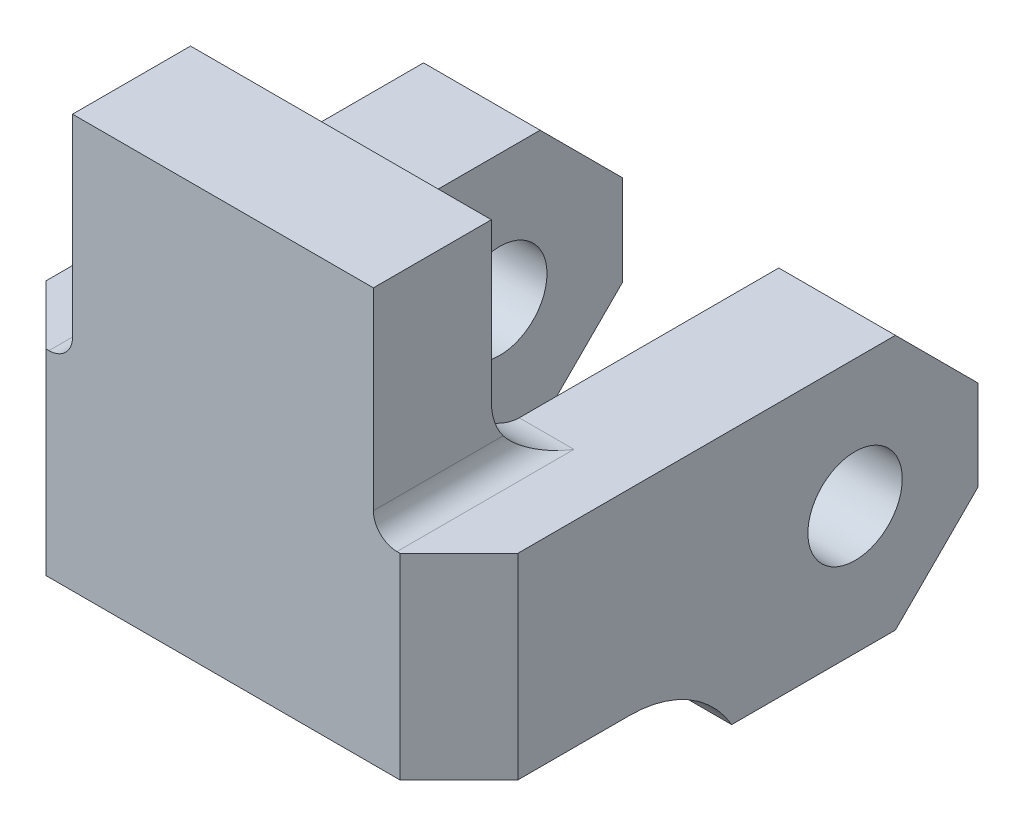
ISO-10303-21;
HEADER;
FILE_DESCRIPTION(('STEP AP214'),'2;1');
FILE_NAME('part.step','',(''),(''),'','','');
FILE_SCHEMA(('AUTOMOTIVE_DESIGN { 1 0 10303 214 1 1 1 1 }'));
ENDSEC;
DATA;
#1=APPLICATION_CONTEXT('core data for automotive mechanical design processes');
#2=APPLICATION_PROTOCOL_DEFINITION('international standard','automotive_design',2000,#1);
#3=PRODUCT_CONTEXT('',#1,'mechanical');
#4=PRODUCT('Part','Part','',(#3));
#5=PRODUCT_RELATED_PRODUCT_CATEGORY('part','',(#4));
#6=PRODUCT_DEFINITION_FORMATION('','',#4);
#7=PRODUCT_DEFINITION_CONTEXT('part definition',#1,'design');
#8=PRODUCT_DEFINITION('design','',#6,#7);
#9=PRODUCT_DEFINITION_SHAPE('','',#8);
#10=(LENGTH_UNIT() NAMED_UNIT(*) SI_UNIT(.MILLI.,.METRE.));
#11=(NAMED_UNIT(*) PLANE_ANGLE_UNIT() SI_UNIT($,.RADIAN.));
#12=(NAMED_UNIT(*) SI_UNIT($,.STERADIAN.) SOLID_ANGLE_UNIT());
#13=UNCERTAINTY_MEASURE_WITH_UNIT(LENGTH_MEASURE(1.E-05),#10,'distance_accuracy_value','');
#14=(GEOMETRIC_REPRESENTATION_CONTEXT(3) GLOBAL_UNCERTAINTY_ASSIGNED_CONTEXT((#13)) GLOBAL_UNIT_ASSIGNED_CONTEXT((#10,
#11,#12)) REPRESENTATION_CONTEXT('',''));
#15=CARTESIAN_POINT('',(0.,0.,0.));
#16=DIRECTION('',(0.,0.,1.));
#17=DIRECTION('',(1.,0.,0.));
#18=AXIS2_PLACEMENT_3D('',#15,#16,#17);
#19=CARTESIAN_POINT('',(12.75,0.,27.1195704816793));
#20=DIRECTION('',(0.,1.,0.));
#21=DIRECTION('',(0.,0.,1.));
#22=AXIS2_PLACEMENT_3D('',#19,#20,#21);
#23=PLANE('',#22);
#24=DIRECTION('',(0.,0.,1.));
#25=VECTOR('',#24,1.);
#26=CARTESIAN_POINT('',(20.,1.03527859391193E-06,-16.8804295183207));
#27=LINE('',#26,#25);
#28=CARTESIAN_POINT('',(20.,1.03527859336769E-06,-9.88042951832072));
#29=VERTEX_POINT('',#28);
#30=CARTESIAN_POINT('',(20.,0.,3.99815958710981));
#31=VERTEX_POINT('',#30);
#32=EDGE_CURVE('E232',#29,#31,#27,.T.);
#33=ORIENTED_EDGE('',*,*,#32,.T.);
#34=DIRECTION('',(1.,0.,0.));
#35=VECTOR('',#34,1.);
#36=CARTESIAN_POINT('',(-23.9922909811862,0.,3.99815958710981));
#37=LINE('',#36,#35);
#38=CARTESIAN_POINT('',(10.1143737072135,0.,3.99815958710981));
#39=VERTEX_POINT('',#38);
#40=EDGE_CURVE('E224',#39,#31,#37,.T.);
#41=ORIENTED_EDGE('',*,*,#40,.F.);
#42=DIRECTION('',(0.,0.,1.));
#43=VECTOR('',#42,1.);
#44=CARTESIAN_POINT('',(10.1143737072135,0.,27.1195704816793));
#45=LINE('',#44,#43);
#46=CARTESIAN_POINT('',(10.1143737072135,0.,-9.88042848304212));
#47=VERTEX_POINT('',#46);
#48=EDGE_CURVE('E467',#47,#39,#45,.T.);
#49=ORIENTED_EDGE('',*,*,#48,.F.);
#50=DIRECTION('',(1.,0.,0.));
#51=VECTOR('',#50,1.);
#52=CARTESIAN_POINT('',(20.,0.,-9.88042848304212));
#53=LINE('',#52,#51);
#54=EDGE_CURVE('E564',#47,#29,#53,.T.);
#55=ORIENTED_EDGE('',*,*,#54,.T.);
#56=EDGE_LOOP('',(#33,#41,#49,#55));
#57=FACE_BOUND('',#56,.T.);
#58=ADVANCED_FACE('F32',(#57),#23,.F.);
#59=CARTESIAN_POINT('',(-12.75,40.,17.1195704816793));
#60=DIRECTION('',(0.,0.,1.));
#61=DIRECTION('',(1.,0.,0.));
#62=AXIS2_PLACEMENT_3D('',#59,#60,#61);
#63=PLANE('',#62);
#64=DIRECTION('',(1.,0.,0.));
#65=VECTOR('',#64,1.);
#66=CARTESIAN_POINT('',(-12.75,5.,17.1195704816793));
#67=LINE('',#66,#65);
#68=CARTESIAN_POINT('',(-5.11437370721345,5.,17.1195704816793));
#69=VERTEX_POINT('',#68);
#70=CARTESIAN_POINT('',(5.11437370721345,5.,17.1195704816793));
#71=VERTEX_POINT('',#70);
#72=EDGE_CURVE('E449',#69,#71,#67,.T.);
#73=ORIENTED_EDGE('',*,*,#72,.F.);
#74=DIRECTION('',(0.,1.,0.));
#75=VECTOR('',#74,1.);
#76=CARTESIAN_POINT('',(-5.11437370721344,40.,17.1195704816793));
#77=LINE('',#76,#75);
#78=CARTESIAN_POINT('',(-5.11437370721345,26.6409777025976,17.1195704816793));
#79=VERTEX_POINT('',#78);
#80=EDGE_CURVE('E446',#69,#79,#77,.T.);
#81=ORIENTED_EDGE('',*,*,#80,.T.);
#82=DIRECTION('',(1.,0.,0.));
#83=VECTOR('',#82,1.);
#84=CARTESIAN_POINT('',(-12.75,26.6409777025976,17.1195704816793));
#85=LINE('',#84,#83);
#86=CARTESIAN_POINT('',(-12.75,26.6409777025976,17.1195704816793));
#87=VERTEX_POINT('',#86);
#88=EDGE_CURVE('E361',#79,#87,#85,.F.);
#89=ORIENTED_EDGE('',*,*,#88,.T.);
#90=DIRECTION('',(0.,-1.,0.));
#91=VECTOR('',#90,1.);
#92=CARTESIAN_POINT('',(-12.75,40.,17.1195704816793));
#93=LINE('',#92,#91);
#94=CARTESIAN_POINT('',(-12.75,40.,17.1195704816793));
#95=VERTEX_POINT('',#94);
#96=EDGE_CURVE('E347',#95,#87,#93,.T.);
#97=ORIENTED_EDGE('',*,*,#96,.F.);
#98=DIRECTION('',(-1.,0.,0.));
#99=VECTOR('',#98,1.);
#100=CARTESIAN_POINT('',(-12.75,40.,17.1195704816793));
#101=LINE('',#100,#99);
#102=CARTESIAN_POINT('',(12.75,40.,17.1195704816793));
#103=VERTEX_POINT('',#102);
#104=EDGE_CURVE('E332',#103,#95,#101,.T.);
#105=ORIENTED_EDGE('',*,*,#104,.F.);
#106=DIRECTION('',(0.,-1.,0.));
#107=VECTOR('',#106,1.);
#108=CARTESIAN_POINT('',(12.75,40.,17.1195704816793));
#109=LINE('',#108,#107);
#110=CARTESIAN_POINT('',(12.75,26.6409777025976,17.1195704816793));
#111=VERTEX_POINT('',#110);
#112=EDGE_CURVE('E342',#103,#111,#109,.T.);
#113=ORIENTED_EDGE('',*,*,#112,.T.);
#114=DIRECTION('',(1.,0.,0.));
#115=VECTOR('',#114,1.);
#116=CARTESIAN_POINT('',(10.1143737072135,26.6409777025976,17.1195704816793));
#117=LINE('',#116,#115);
#118=CARTESIAN_POINT('',(5.11437370721346,26.6409777025976,17.1195704816793));
#119=VERTEX_POINT('',#118);
#120=EDGE_CURVE('E363',#111,#119,#117,.F.);
#121=ORIENTED_EDGE('',*,*,#120,.T.);
#122=DIRECTION('',(0.,-1.,0.));
#123=VECTOR('',#122,1.);
#124=CARTESIAN_POINT('',(5.11437370721345,40.,17.1195704816793));
#125=LINE('',#124,#123);
#126=EDGE_CURVE('E512',#119,#71,#125,.T.);
#127=ORIENTED_EDGE('',*,*,#126,.T.);
#128=EDGE_LOOP('',(#73,#81,#89,#97,#105,#113,#121,#127));
#129=FACE_BOUND('',#128,.T.);
#130=ADVANCED_FACE('F286',(#129),#63,.F.);
#131=CARTESIAN_POINT('',(-12.75,40.,27.1195704816793));
#132=DIRECTION('',(0.,0.,-1.));
#133=DIRECTION('',(-1.,0.,0.));
#134=AXIS2_PLACEMENT_3D('',#131,#132,#133);
#135=PLANE('',#134);
#136=DIRECTION('',(-1.,0.,0.));
#137=VECTOR('',#136,1.);
#138=CARTESIAN_POINT('',(-12.75,5.,27.1195704816793));
#139=LINE('',#138,#137);
#140=CARTESIAN_POINT('',(15.,5.,27.1195704816793));
#141=VERTEX_POINT('',#140);
#142=CARTESIAN_POINT('',(-15.,5.,27.1195704816793));
#143=VERTEX_POINT('',#142);
#144=EDGE_CURVE('E547',#141,#143,#139,.T.);
#145=ORIENTED_EDGE('',*,*,#144,.F.);
#146=DIRECTION('',(0.,1.,0.));
#147=VECTOR('',#146,1.);
#148=CARTESIAN_POINT('',(15.,40.,27.1195704816793));
#149=LINE('',#148,#147);
#150=CARTESIAN_POINT('',(15.,21.6409777025976,27.1195704816793));
#151=VERTEX_POINT('',#150);
#152=EDGE_CURVE('E530',#141,#151,#149,.T.);
#153=ORIENTED_EDGE('',*,*,#152,.T.);
#154=DIRECTION('',(1.,0.,0.));
#155=VECTOR('',#154,1.);
#156=CARTESIAN_POINT('',(20.,21.6409777025976,27.1195704816793));
#157=LINE('',#156,#155);
#158=CARTESIAN_POINT('',(14.75,21.6409777025976,27.1195704816793));
#159=VERTEX_POINT('',#158);
#160=EDGE_CURVE('E473',#159,#151,#157,.T.);
#161=ORIENTED_EDGE('',*,*,#160,.F.);
#162=CARTESIAN_POINT('',(14.75,23.6409777025976,27.1195704816793));
#163=DIRECTION('',(0.,0.,-1.));
#164=DIRECTION('',(-1.,0.,0.));
#165=AXIS2_PLACEMENT_3D('',#162,#163,#164);
#166=CIRCLE('',#165,2.);
#167=CARTESIAN_POINT('',(12.75,23.6409777025976,27.1195704816793));
#168=VERTEX_POINT('',#167);
#169=EDGE_CURVE('E413',#159,#168,#166,.T.);
#170=ORIENTED_EDGE('',*,*,#169,.T.);
#171=DIRECTION('',(0.,-1.,0.));
#172=VECTOR('',#171,1.);
#173=CARTESIAN_POINT('',(12.75,40.,27.1195704816793));
#174=LINE('',#173,#172);
#175=CARTESIAN_POINT('',(12.75,40.,27.1195704816793));
#176=VERTEX_POINT('',#175);
#177=EDGE_CURVE('E490',#176,#168,#174,.T.);
#178=ORIENTED_EDGE('',*,*,#177,.F.);
#179=DIRECTION('',(1.,0.,0.));
#180=VECTOR('',#179,1.);
#181=CARTESIAN_POINT('',(-12.75,40.,27.1195704816793));
#182=LINE('',#181,#180);
#183=CARTESIAN_POINT('',(-12.75,40.,27.1195704816793));
#184=VERTEX_POINT('',#183);
#185=EDGE_CURVE('E335',#184,#176,#182,.T.);
#186=ORIENTED_EDGE('',*,*,#185,.F.);
#187=DIRECTION('',(0.,-1.,0.));
#188=VECTOR('',#187,1.);
#189=CARTESIAN_POINT('',(-12.75,40.,27.1195704816793));
#190=LINE('',#189,#188);
#191=CARTESIAN_POINT('',(-12.75,23.6409777025976,27.1195704816793));
#192=VERTEX_POINT('',#191);
#193=EDGE_CURVE('E353',#184,#192,#190,.T.);
#194=ORIENTED_EDGE('',*,*,#193,.T.);
#195=CARTESIAN_POINT('',(-14.75,23.6409777025976,27.1195704816793));
#196=DIRECTION('',(0.,0.,-1.));
#197=DIRECTION('',(-1.,0.,0.));
#198=AXIS2_PLACEMENT_3D('',#195,#196,#197);
#199=CIRCLE('',#198,2.);
#200=CARTESIAN_POINT('',(-14.75,21.6409777025976,27.1195704816793));
#201=VERTEX_POINT('',#200);
#202=EDGE_CURVE('E389',#192,#201,#199,.T.);
#203=ORIENTED_EDGE('',*,*,#202,.T.);
#204=CARTESIAN_POINT('',(-15.,21.6409777025976,27.1195704816793));
#205=VERTEX_POINT('',#204);
#206=EDGE_CURVE('E477',#205,#201,#157,.T.);
#207=ORIENTED_EDGE('',*,*,#206,.F.);
#208=DIRECTION('',(0.,-1.,0.));
#209=VECTOR('',#208,1.);
#210=CARTESIAN_POINT('',(-15.,40.,27.1195704816793));
#211=LINE('',#210,#209);
#212=EDGE_CURVE('E532',#205,#143,#211,.T.);
#213=ORIENTED_EDGE('',*,*,#212,.T.);
#214=EDGE_LOOP('',(#145,#153,#161,#170,#178,#186,#194,#203,#207,#213));
#215=FACE_BOUND('',#214,.T.);
#216=ADVANCED_FACE('F292',(#215),#135,.F.);
#217=CARTESIAN_POINT('',(-5.11437370721344,40.,12.1195704816793));
#218=DIRECTION('',(0.,1.,0.));
#219=DIRECTION('',(-1.,0.,0.));
#220=AXIS2_PLACEMENT_3D('',#217,#218,#219);
#221=CYLINDRICAL_SURFACE('',#220,5.);
#222=CARTESIAN_POINT('',(-5.11437370721345,5.,12.1195704816793));
#223=DIRECTION('',(0.,-1.,0.));
#224=DIRECTION('',(0.,0.,-1.));
#225=AXIS2_PLACEMENT_3D('',#222,#223,#224);
#226=CIRCLE('',#225,5.);
#227=CARTESIAN_POINT('',(-10.0852537165222,5.,12.6584136249542));
#228=VERTEX_POINT('',#227);
#229=EDGE_CURVE('E444',#228,#69,#226,.F.);
#230=ORIENTED_EDGE('',*,*,#229,.F.);
#231=CARTESIAN_POINT('',(-10.0852537165222,5.,12.6584136249542));
#232=CARTESIAN_POINT('',(-10.0949603684732,5.00000662139516,12.5688032534376));
#233=CARTESIAN_POINT('',(-10.1022403603396,4.99879925292525,12.4790944724063));
#234=CARTESIAN_POINT('',(-10.1119470239033,4.99395653625529,12.2994800913147));
#235=CARTESIAN_POINT('',(-10.1143736956007,4.99032118805525,12.2095744912543));
#236=CARTESIAN_POINT('',(-10.1143737072135,4.98547184999015,12.1195704816793));
#237=B_SPLINE_CURVE_WITH_KNOTS('',3,(#231,#232,#233,#234,#235,#236),.UNSPECIFIED.,.F.,.F.,(4,2,
4),(0.,0.2700353545905,0.540070709180428),.UNSPECIFIED.);
#238=CARTESIAN_POINT('',(-10.1143737072135,4.98547184999015,12.1195704816793));
#239=VERTEX_POINT('',#238);
#240=EDGE_CURVE('E238',#228,#239,#237,.T.);
#241=ORIENTED_EDGE('',*,*,#240,.T.);
#242=DIRECTION('',(0.,1.,0.));
#243=VECTOR('',#242,1.);
#244=CARTESIAN_POINT('',(-10.1143737072135,-27.7368032770758,12.1195704816793));
#245=LINE('',#244,#243);
#246=CARTESIAN_POINT('',(-10.1143737072134,21.6409777025976,12.1195704816793));
#247=VERTEX_POINT('',#246);
#248=EDGE_CURVE('E48',#247,#239,#245,.F.);
#249=ORIENTED_EDGE('',*,*,#248,.F.);
#250=CARTESIAN_POINT('',(-5.11437370721345,26.6409777025976,12.1195704816793));
#251=DIRECTION('',(-0.707106781186547,0.707106781186548,0.));
#252=DIRECTION('',(-0.707106781186548,-0.707106781186547,0.));
#253=AXIS2_PLACEMENT_3D('',#250,#251,#252);
#254=ELLIPSE('',#253,7.07106781186548,5.);
#255=EDGE_CURVE('E523',#79,#247,#254,.F.);
#256=ORIENTED_EDGE('',*,*,#255,.F.);
#257=ORIENTED_EDGE('',*,*,#80,.F.);
#258=EDGE_LOOP('',(#230,#241,#249,#256,#257));
#259=FACE_BOUND('',#258,.T.);
#260=ADVANCED_FACE('F283',(#259),#221,.F.);
#261=CARTESIAN_POINT('',(5.11437370721346,40.,12.1195704816793));
#262=DIRECTION('',(0.,-1.,0.));
#263=DIRECTION('',(1.,0.,0.));
#264=AXIS2_PLACEMENT_3D('',#261,#262,#263);
#265=CYLINDRICAL_SURFACE('',#264,5.);
#266=CARTESIAN_POINT('',(5.11437370721345,5.,12.1195704816793));
#267=DIRECTION('',(0.,-1.,0.));
#268=DIRECTION('',(0.,0.,-1.));
#269=AXIS2_PLACEMENT_3D('',#266,#267,#268);
#270=CIRCLE('',#269,5.);
#271=CARTESIAN_POINT('',(10.0852537165222,5.,12.6584136249542));
#272=VERTEX_POINT('',#271);
#273=EDGE_CURVE('E454',#71,#272,#270,.F.);
#274=ORIENTED_EDGE('',*,*,#273,.F.);
#275=ORIENTED_EDGE('',*,*,#126,.F.);
#276=CARTESIAN_POINT('',(5.11437370721346,26.6409777025976,12.1195704816793));
#277=DIRECTION('',(-0.707106781186548,-0.707106781186547,0.));
#278=DIRECTION('',(-0.707106781186547,0.707106781186548,0.));
#279=AXIS2_PLACEMENT_3D('',#276,#277,#278);
#280=ELLIPSE('',#279,7.07106781186547,5.);
#281=CARTESIAN_POINT('',(10.1143737072135,21.6409777025976,12.1195704816793));
#282=VERTEX_POINT('',#281);
#283=EDGE_CURVE('E509',#282,#119,#280,.T.);
#284=ORIENTED_EDGE('',*,*,#283,.F.);
#285=DIRECTION('',(0.,-1.,0.));
#286=VECTOR('',#285,1.);
#287=CARTESIAN_POINT('',(10.1143737072135,-27.7368032770758,12.1195704816793));
#288=LINE('',#287,#286);
#289=CARTESIAN_POINT('',(10.1143737072135,4.98547184999015,12.1195704816793));
#290=VERTEX_POINT('',#289);
#291=EDGE_CURVE('E56',#290,#282,#288,.F.);
#292=ORIENTED_EDGE('',*,*,#291,.F.);
#293=CARTESIAN_POINT('',(10.1143737072135,4.98547184999014,12.1195704816793));
#294=CARTESIAN_POINT('',(10.1143736956007,4.99032118805525,12.2095744912543));
#295=CARTESIAN_POINT('',(10.1119470239033,4.99395653625529,12.2994800913147));
#296=CARTESIAN_POINT('',(10.1022403603396,4.99879925292525,12.4790944724063));
#297=CARTESIAN_POINT('',(10.0949603684732,5.00000662139516,12.5688032534376));
#298=CARTESIAN_POINT('',(10.0852537165222,5.,12.6584136249542));
#299=B_SPLINE_CURVE_WITH_KNOTS('',3,(#293,#294,#295,#296,#297,#298),.UNSPECIFIED.,.F.,.F.,(4,2,
4),(0.,0.270035354589928,0.540070709180428),.UNSPECIFIED.);
#300=EDGE_CURVE('E255',#290,#272,#299,.T.);
#301=ORIENTED_EDGE('',*,*,#300,.T.);
#302=EDGE_LOOP('',(#274,#275,#284,#292,#301));
#303=FACE_BOUND('',#302,.T.);
#304=ADVANCED_FACE('F265',(#303),#265,.F.);
#305=CARTESIAN_POINT('',(-20.,21.6409777025976,22.1195704816793));
#306=DIRECTION('',(0.707106781186547,0.,-0.707106781186548));
#307=DIRECTION('',(-0.707106781186548,0.,-0.707106781186547));
#308=AXIS2_PLACEMENT_3D('',#305,#306,#307);
#309=PLANE('',#308);
#310=DIRECTION('',(0.,1.,0.));
#311=VECTOR('',#310,1.);
#312=CARTESIAN_POINT('',(-20.,21.6409777025976,22.1195704816793));
#313=LINE('',#312,#311);
#314=CARTESIAN_POINT('',(-20.,5.,22.1195704816793));
#315=VERTEX_POINT('',#314);
#316=CARTESIAN_POINT('',(-20.,21.6409777025976,22.1195704816793));
#317=VERTEX_POINT('',#316);
#318=EDGE_CURVE('E526',#315,#317,#313,.T.);
#319=ORIENTED_EDGE('',*,*,#318,.F.);
#320=DIRECTION('',(-0.707106781186548,0.,-0.707106781186547));
#321=VECTOR('',#320,1.);
#322=CARTESIAN_POINT('',(-20.,5.,22.1195704816793));
#323=LINE('',#322,#321);
#324=EDGE_CURVE('E550',#315,#143,#323,.F.);
#325=ORIENTED_EDGE('',*,*,#324,.T.);
#326=ORIENTED_EDGE('',*,*,#212,.F.);
#327=DIRECTION('',(-0.707106781186548,0.,-0.707106781186547));
#328=VECTOR('',#327,1.);
#329=CARTESIAN_POINT('',(-20.,21.6409777025976,22.1195704816793));
#330=LINE('',#329,#328);
#331=EDGE_CURVE('E528',#317,#205,#330,.F.);
#332=ORIENTED_EDGE('',*,*,#331,.F.);
#333=EDGE_LOOP('',(#319,#325,#326,#332));
#334=FACE_BOUND('',#333,.T.);
#335=ADVANCED_FACE('F276',(#334),#309,.F.);
#336=CARTESIAN_POINT('',(20.,21.6409777025976,22.1195704816793));
#337=DIRECTION('',(-0.707106781186547,0.,-0.707106781186548));
#338=DIRECTION('',(-0.707106781186548,0.,0.707106781186547));
#339=AXIS2_PLACEMENT_3D('',#336,#337,#338);
#340=PLANE('',#339);
#341=ORIENTED_EDGE('',*,*,#152,.F.);
#342=DIRECTION('',(-0.707106781186548,0.,0.707106781186547));
#343=VECTOR('',#342,1.);
#344=CARTESIAN_POINT('',(20.,5.,22.1195704816793));
#345=LINE('',#344,#343);
#346=CARTESIAN_POINT('',(20.,5.,22.1195704816793));
#347=VERTEX_POINT('',#346);
#348=EDGE_CURVE('E242',#141,#347,#345,.F.);
#349=ORIENTED_EDGE('',*,*,#348,.T.);
#350=DIRECTION('',(0.,-1.,0.));
#351=VECTOR('',#350,1.);
#352=CARTESIAN_POINT('',(20.,21.6409777025976,22.1195704816793));
#353=LINE('',#352,#351);
#354=CARTESIAN_POINT('',(20.,21.6409777025976,22.1195704816793));
#355=VERTEX_POINT('',#354);
#356=EDGE_CURVE('E535',#355,#347,#353,.T.);
#357=ORIENTED_EDGE('',*,*,#356,.F.);
#358=DIRECTION('',(-0.707106781186548,0.,0.707106781186547));
#359=VECTOR('',#358,1.);
#360=CARTESIAN_POINT('',(20.,21.6409777025976,22.1195704816793));
#361=LINE('',#360,#359);
#362=EDGE_CURVE('E248',#151,#355,#361,.F.);
#363=ORIENTED_EDGE('',*,*,#362,.F.);
#364=EDGE_LOOP('',(#341,#349,#357,#363));
#365=FACE_BOUND('',#364,.T.);
#366=ADVANCED_FACE('F274',(#365),#340,.F.);
#367=DIRECTION('',(0.,0.,-1.));
#368=VECTOR('',#367,1.);
#369=CARTESIAN_POINT('',(-10.1143737072135,0.,27.1195704816793));
#370=LINE('',#369,#368);
#371=CARTESIAN_POINT('',(-10.1143737072135,0.,3.99815958710981));
#372=VERTEX_POINT('',#371);
#373=CARTESIAN_POINT('',(-10.1143737072135,0.,-9.8804284830421));
#374=VERTEX_POINT('',#373);
#375=EDGE_CURVE('E219',#372,#374,#370,.T.);
#376=ORIENTED_EDGE('',*,*,#375,.F.);
#377=CARTESIAN_POINT('',(-20.,0.,3.99815958710981));
#378=VERTEX_POINT('',#377);
#379=EDGE_CURVE('E213',#378,#372,#37,.T.);
#380=ORIENTED_EDGE('',*,*,#379,.F.);
#381=DIRECTION('',(0.,0.,1.));
#382=VECTOR('',#381,1.);
#383=CARTESIAN_POINT('',(-20.,1.03527861105698E-06,-16.8804295183207));
#384=LINE('',#383,#382);
#385=CARTESIAN_POINT('',(-20.,1.03527861099217E-06,-9.8804284830421));
#386=VERTEX_POINT('',#385);
#387=EDGE_CURVE('E217',#386,#378,#384,.T.);
#388=ORIENTED_EDGE('',*,*,#387,.F.);
#389=DIRECTION('',(1.,0.,0.));
#390=VECTOR('',#389,1.);
#391=CARTESIAN_POINT('',(-10.1143737072135,0.,-9.8804284830421));
#392=LINE('',#391,#390);
#393=EDGE_CURVE('E565',#386,#374,#392,.T.);
#394=ORIENTED_EDGE('',*,*,#393,.T.);
#395=EDGE_LOOP('',(#376,#380,#388,#394));
#396=FACE_BOUND('',#395,.T.);
#397=ADVANCED_FACE('F215',(#396),#23,.F.);
#398=CARTESIAN_POINT('',(20.,21.6409777025976,-16.8804295183207));
#399=DIRECTION('',(0.,-1.,0.));
#400=DIRECTION('',(0.,0.,-1.));
#401=AXIS2_PLACEMENT_3D('',#398,#399,#400);
#402=PLANE('',#401);
#403=DIRECTION('',(0.,0.,1.));
#404=VECTOR('',#403,1.);
#405=CARTESIAN_POINT('',(-20.,21.6409777025976,-16.8804295183207));
#406=LINE('',#405,#404);
#407=CARTESIAN_POINT('',(-20.,21.6409777025976,-9.8804295183207));
#408=VERTEX_POINT('',#407);
#409=EDGE_CURVE('E339',#408,#317,#406,.T.);
#410=ORIENTED_EDGE('',*,*,#409,.T.);
#411=ORIENTED_EDGE('',*,*,#331,.T.);
#412=ORIENTED_EDGE('',*,*,#206,.T.);
#413=DIRECTION('',(0.,0.,-1.));
#414=VECTOR('',#413,1.);
#415=CARTESIAN_POINT('',(-14.75,21.6409777025976,12.1195704816793));
#416=LINE('',#415,#414);
#417=CARTESIAN_POINT('',(-14.75,21.6409777025976,12.1195704816793));
#418=VERTEX_POINT('',#417);
#419=EDGE_CURVE('E372',#201,#418,#416,.T.);
#420=ORIENTED_EDGE('',*,*,#419,.T.);
#421=DIRECTION('',(1.,0.,0.));
#422=VECTOR('',#421,1.);
#423=CARTESIAN_POINT('',(-10.1143737072134,21.6409777025976,12.1195704816793));
#424=LINE('',#423,#422);
#425=EDGE_CURVE('E365',#418,#247,#424,.T.);
#426=ORIENTED_EDGE('',*,*,#425,.T.);
#427=DIRECTION('',(0.,0.,1.));
#428=VECTOR('',#427,1.);
#429=CARTESIAN_POINT('',(-10.1143737072134,21.6409777025976,-16.8804295183207));
#430=LINE('',#429,#428);
#431=CARTESIAN_POINT('',(-10.1143737072134,21.6409777025976,-9.8804295183207));
#432=VERTEX_POINT('',#431);
#433=EDGE_CURVE('E470',#432,#247,#430,.T.);
#434=ORIENTED_EDGE('',*,*,#433,.F.);
#435=DIRECTION('',(-1.,0.,0.));
#436=VECTOR('',#435,1.);
#437=CARTESIAN_POINT('',(-20.,21.6409777025976,-9.8804295183207));
#438=LINE('',#437,#436);
#439=EDGE_CURVE('E517',#432,#408,#438,.T.);
#440=ORIENTED_EDGE('',*,*,#439,.T.);
#441=EDGE_LOOP('',(#410,#411,#412,#420,#426,#434,#440));
#442=FACE_BOUND('',#441,.T.);
#443=ADVANCED_FACE('F299',(#442),#402,.F.);
#444=ORIENTED_EDGE('',*,*,#160,.T.);
#445=ORIENTED_EDGE('',*,*,#362,.T.);
#446=DIRECTION('',(0.,0.,1.));
#447=VECTOR('',#446,1.);
#448=CARTESIAN_POINT('',(20.,21.6409777025976,-16.8804295183207));
#449=LINE('',#448,#447);
#450=CARTESIAN_POINT('',(20.,21.6409777025976,-9.8804295183207));
#451=VERTEX_POINT('',#450);
#452=EDGE_CURVE('E482',#451,#355,#449,.T.);
#453=ORIENTED_EDGE('',*,*,#452,.F.);
#454=DIRECTION('',(-1.,0.,0.));
#455=VECTOR('',#454,1.);
#456=CARTESIAN_POINT('',(10.1143737072135,21.6409777025976,-9.8804295183207));
#457=LINE('',#456,#455);
#458=CARTESIAN_POINT('',(10.1143737072135,21.6409777025976,-9.88042951832071));
#459=VERTEX_POINT('',#458);
#460=EDGE_CURVE('E514',#451,#459,#457,.T.);
#461=ORIENTED_EDGE('',*,*,#460,.T.);
#462=DIRECTION('',(0.,0.,-1.));
#463=VECTOR('',#462,1.);
#464=CARTESIAN_POINT('',(10.1143737072135,21.6409777025976,-16.8804295183207));
#465=LINE('',#464,#463);
#466=EDGE_CURVE('E464',#282,#459,#465,.T.);
#467=ORIENTED_EDGE('',*,*,#466,.F.);
#468=DIRECTION('',(1.,0.,0.));
#469=VECTOR('',#468,1.);
#470=CARTESIAN_POINT('',(12.75,21.6409777025976,12.1195704816793));
#471=LINE('',#470,#469);
#472=CARTESIAN_POINT('',(14.75,21.6409777025976,12.1195704816793));
#473=VERTEX_POINT('',#472);
#474=EDGE_CURVE('E359',#282,#473,#471,.T.);
#475=ORIENTED_EDGE('',*,*,#474,.T.);
#476=DIRECTION('',(0.,0.,1.));
#477=VECTOR('',#476,1.);
#478=CARTESIAN_POINT('',(14.75,21.6409777025976,27.1195704816793));
#479=LINE('',#478,#477);
#480=EDGE_CURVE('E377',#473,#159,#479,.T.);
#481=ORIENTED_EDGE('',*,*,#480,.T.);
#482=EDGE_LOOP('',(#444,#445,#453,#461,#467,#475,#481));
#483=FACE_BOUND('',#482,.T.);
#484=ADVANCED_FACE('F303',(#483),#402,.F.);
#485=CARTESIAN_POINT('',(-20.,1.03527861105698E-06,-16.8804295183207));
#486=DIRECTION('',(0.,0.,-1.));
#487=DIRECTION('',(-1.,0.,0.));
#488=AXIS2_PLACEMENT_3D('',#485,#486,#487);
#489=PLANE('',#488);
#490=DIRECTION('',(0.,-1.,0.));
#491=VECTOR('',#490,1.);
#492=CARTESIAN_POINT('',(-10.1143737072135,1.03527860982044E-06,-16.8804295183207));
#493=LINE('',#492,#491);
#494=CARTESIAN_POINT('',(-10.1143737072134,14.6409777025976,-16.8804295183207));
#495=VERTEX_POINT('',#494);
#496=CARTESIAN_POINT('',(-10.1143737072135,7.00000103527861,-16.8804295183207));
#497=VERTEX_POINT('',#496);
#498=EDGE_CURVE('E350',#495,#497,#493,.T.);
#499=ORIENTED_EDGE('',*,*,#498,.T.);
#500=DIRECTION('',(-1.,0.,0.));
#501=VECTOR('',#500,1.);
#502=CARTESIAN_POINT('',(-20.,7.00000103527861,-16.8804295183207));
#503=LINE('',#502,#501);
#504=CARTESIAN_POINT('',(-20.,7.0000010352786,-16.8804295183207));
#505=VERTEX_POINT('',#504);
#506=EDGE_CURVE('E596',#497,#505,#503,.T.);
#507=ORIENTED_EDGE('',*,*,#506,.T.);
#508=DIRECTION('',(0.,1.,0.));
#509=VECTOR('',#508,1.);
#510=CARTESIAN_POINT('',(-20.,21.6409777025976,-16.8804295183207));
#511=LINE('',#510,#509);
#512=CARTESIAN_POINT('',(-20.,14.6409777025976,-16.8804295183207));
#513=VERTEX_POINT('',#512);
#514=EDGE_CURVE('E474',#505,#513,#511,.T.);
#515=ORIENTED_EDGE('',*,*,#514,.T.);
#516=DIRECTION('',(1.,0.,0.));
#517=VECTOR('',#516,1.);
#518=CARTESIAN_POINT('',(-10.1143737072134,14.6409777025976,-16.8804295183207));
#519=LINE('',#518,#517);
#520=EDGE_CURVE('E412',#513,#495,#519,.T.);
#521=ORIENTED_EDGE('',*,*,#520,.T.);
#522=EDGE_LOOP('',(#499,#507,#515,#521));
#523=FACE_BOUND('',#522,.T.);
#524=ADVANCED_FACE('F309',(#523),#489,.T.);
#525=DIRECTION('',(0.,-1.,0.));
#526=VECTOR('',#525,1.);
#527=CARTESIAN_POINT('',(20.,21.6409777025976,-16.8804295183207));
#528=LINE('',#527,#526);
#529=CARTESIAN_POINT('',(20.,14.6409777025976,-16.8804295183207));
#530=VERTEX_POINT('',#529);
#531=CARTESIAN_POINT('',(20.,7.00000103527859,-16.8804295183207));
#532=VERTEX_POINT('',#531);
#533=EDGE_CURVE('E233',#530,#532,#528,.T.);
#534=ORIENTED_EDGE('',*,*,#533,.T.);
#535=DIRECTION('',(-1.,0.,0.));
#536=VECTOR('',#535,1.);
#537=CARTESIAN_POINT('',(10.1143737072135,7.00000103527858,-16.8804295183207));
#538=LINE('',#537,#536);
#539=CARTESIAN_POINT('',(10.1143737072135,7.00000103527859,-16.8804295183207));
#540=VERTEX_POINT('',#539);
#541=EDGE_CURVE('E579',#532,#540,#538,.T.);
#542=ORIENTED_EDGE('',*,*,#541,.T.);
#543=DIRECTION('',(0.,1.,0.));
#544=VECTOR('',#543,1.);
#545=CARTESIAN_POINT('',(10.1143737072135,1.03527860729014E-06,-16.8804295183207));
#546=LINE('',#545,#544);
#547=CARTESIAN_POINT('',(10.1143737072135,14.6409777025976,-16.8804295183207));
#548=VERTEX_POINT('',#547);
#549=EDGE_CURVE('E346',#540,#548,#546,.T.);
#550=ORIENTED_EDGE('',*,*,#549,.T.);
#551=DIRECTION('',(1.,0.,0.));
#552=VECTOR('',#551,1.);
#553=CARTESIAN_POINT('',(20.,14.6409777025976,-16.8804295183207));
#554=LINE('',#553,#552);
#555=EDGE_CURVE('E576',#548,#530,#554,.T.);
#556=ORIENTED_EDGE('',*,*,#555,.T.);
#557=EDGE_LOOP('',(#534,#542,#550,#556));
#558=FACE_BOUND('',#557,.T.);
#559=ADVANCED_FACE('F625',(#558),#489,.T.);
#560=CARTESIAN_POINT('',(12.75,40.,17.1195704816793));
#561=DIRECTION('',(-1.,0.,0.));
#562=DIRECTION('',(0.,0.,1.));
#563=AXIS2_PLACEMENT_3D('',#560,#561,#562);
#564=PLANE('',#563);
#565=ORIENTED_EDGE('',*,*,#177,.T.);
#566=DIRECTION('',(0.,0.,1.));
#567=VECTOR('',#566,1.);
#568=CARTESIAN_POINT('',(12.75,23.6409777025976,12.1195704816793));
#569=LINE('',#568,#567);
#570=CARTESIAN_POINT('',(12.75,23.6409777025976,16.1195704816793));
#571=VERTEX_POINT('',#570);
#572=EDGE_CURVE('E380',#168,#571,#569,.F.);
#573=ORIENTED_EDGE('',*,*,#572,.T.);
#574=CARTESIAN_POINT('',(12.75,26.6409777025976,12.1195704816793));
#575=DIRECTION('',(-1.,0.,0.));
#576=DIRECTION('',(0.,0.,1.));
#577=AXIS2_PLACEMENT_3D('',#574,#575,#576);
#578=CIRCLE('',#577,5.);
#579=EDGE_CURVE('E344',#571,#111,#578,.T.);
#580=ORIENTED_EDGE('',*,*,#579,.T.);
#581=ORIENTED_EDGE('',*,*,#112,.F.);
#582=DIRECTION('',(0.,0.,-1.));
#583=VECTOR('',#582,1.);
#584=CARTESIAN_POINT('',(12.75,40.,17.1195704816793));
#585=LINE('',#584,#583);
#586=EDGE_CURVE('E330',#176,#103,#585,.T.);
#587=ORIENTED_EDGE('',*,*,#586,.F.);
#588=EDGE_LOOP('',(#565,#573,#580,#581,#587));
#589=FACE_BOUND('',#588,.T.);
#590=ADVANCED_FACE('F325',(#589),#564,.F.);
#591=CARTESIAN_POINT('',(-12.75,40.,17.1195704816793));
#592=DIRECTION('',(1.,0.,0.));
#593=DIRECTION('',(0.,0.,-1.));
#594=AXIS2_PLACEMENT_3D('',#591,#592,#593);
#595=PLANE('',#594);
#596=CARTESIAN_POINT('',(-12.75,26.6409777025976,12.1195704816793));
#597=DIRECTION('',(1.,0.,0.));
#598=DIRECTION('',(0.,0.,-1.));
#599=AXIS2_PLACEMENT_3D('',#596,#597,#598);
#600=CIRCLE('',#599,5.);
#601=CARTESIAN_POINT('',(-12.75,23.6409777025976,16.1195704816793));
#602=VERTEX_POINT('',#601);
#603=EDGE_CURVE('E369',#87,#602,#600,.T.);
#604=ORIENTED_EDGE('',*,*,#603,.T.);
#605=DIRECTION('',(0.,0.,-1.));
#606=VECTOR('',#605,1.);
#607=CARTESIAN_POINT('',(-12.75,23.6409777025976,27.1195704816793));
#608=LINE('',#607,#606);
#609=EDGE_CURVE('E375',#602,#192,#608,.F.);
#610=ORIENTED_EDGE('',*,*,#609,.T.);
#611=ORIENTED_EDGE('',*,*,#193,.F.);
#612=DIRECTION('',(0.,0.,1.));
#613=VECTOR('',#612,1.);
#614=CARTESIAN_POINT('',(-12.75,40.,17.1195704816793));
#615=LINE('',#614,#613);
#616=EDGE_CURVE('E487',#95,#184,#615,.T.);
#617=ORIENTED_EDGE('',*,*,#616,.F.);
#618=ORIENTED_EDGE('',*,*,#96,.T.);
#619=EDGE_LOOP('',(#604,#610,#611,#617,#618));
#620=FACE_BOUND('',#619,.T.);
#621=ADVANCED_FACE('F320',(#620),#595,.F.);
#622=CARTESIAN_POINT('',(12.75,40.,27.1195704816793));
#623=DIRECTION('',(0.,1.,0.));
#624=DIRECTION('',(0.,0.,1.));
#625=AXIS2_PLACEMENT_3D('',#622,#623,#624);
#626=PLANE('',#625);
#627=ORIENTED_EDGE('',*,*,#586,.T.);
#628=ORIENTED_EDGE('',*,*,#104,.T.);
#629=ORIENTED_EDGE('',*,*,#616,.T.);
#630=ORIENTED_EDGE('',*,*,#185,.T.);
#631=EDGE_LOOP('',(#627,#628,#629,#630));
#632=FACE_BOUND('',#631,.T.);
#633=ADVANCED_FACE('F317',(#632),#626,.T.);
#634=CARTESIAN_POINT('',(-20.,21.6409777025976,-16.8804295183207));
#635=DIRECTION('',(1.,0.,0.));
#636=DIRECTION('',(0.,1.,0.));
#637=AXIS2_PLACEMENT_3D('',#634,#635,#636);
#638=PLANE('',#637);
#639=CARTESIAN_POINT('',(-20.,10.8204893689381,-6.46097507609766));
#640=DIRECTION('',(1.,0.,0.));
#641=DIRECTION('',(0.,0.,-1.));
#642=AXIS2_PLACEMENT_3D('',#639,#640,#641);
#643=CIRCLE('',#642,4.);
#644=CARTESIAN_POINT('',(-20.,10.8204893689381,-10.4609750760977));
#645=VERTEX_POINT('',#644);
#646=EDGE_CURVE('E452',#645,#645,#643,.T.);
#647=ORIENTED_EDGE('',*,*,#646,.T.);
#648=EDGE_LOOP('',(#647));
#649=FACE_BOUND('',#648,.T.);
#650=ORIENTED_EDGE('',*,*,#387,.T.);
#651=CARTESIAN_POINT('',(-20.,-5.,12.6584136249542));
#652=DIRECTION('',(1.,0.,0.));
#653=DIRECTION('',(0.,1.,0.));
#654=AXIS2_PLACEMENT_3D('',#651,#652,#653);
#655=CIRCLE('',#654,10.);
#656=CARTESIAN_POINT('',(-20.,5.,12.6584136249542));
#657=VERTEX_POINT('',#656);
#658=EDGE_CURVE('E11',#378,#657,#655,.T.);
#659=ORIENTED_EDGE('',*,*,#658,.T.);
#660=DIRECTION('',(0.,0.,-1.));
#661=VECTOR('',#660,1.);
#662=CARTESIAN_POINT('',(-20.,5.,-16.8804295183207));
#663=LINE('',#662,#661);
#664=EDGE_CURVE('E552',#315,#657,#663,.T.);
#665=ORIENTED_EDGE('',*,*,#664,.F.);
#666=ORIENTED_EDGE('',*,*,#318,.T.);
#667=ORIENTED_EDGE('',*,*,#409,.F.);
#668=DIRECTION('',(0.,-0.707106781186546,-0.707106781186549));
#669=VECTOR('',#668,1.);
#670=CARTESIAN_POINT('',(-20.,14.6409777025976,-16.8804295183207));
#671=LINE('',#670,#669);
#672=EDGE_CURVE('E569',#408,#513,#671,.T.);
#673=ORIENTED_EDGE('',*,*,#672,.T.);
#674=ORIENTED_EDGE('',*,*,#514,.F.);
#675=DIRECTION('',(0.,-0.707106781186546,0.707106781186549));
#676=VECTOR('',#675,1.);
#677=CARTESIAN_POINT('',(-20.,7.00000103527861,-16.8804295183207));
#678=LINE('',#677,#676);
#679=EDGE_CURVE('E231',#505,#386,#678,.T.);
#680=ORIENTED_EDGE('',*,*,#679,.T.);
#681=EDGE_LOOP('',(#650,#659,#665,#666,#667,#673,#674,#680));
#682=FACE_BOUND('',#681,.T.);
#683=ADVANCED_FACE('F227',(#649,#682),#638,.F.);
#684=CARTESIAN_POINT('',(20.,21.6409777025976,-16.8804295183207));
#685=DIRECTION('',(-1.,0.,0.));
#686=DIRECTION('',(0.,0.,1.));
#687=AXIS2_PLACEMENT_3D('',#684,#685,#686);
#688=PLANE('',#687);
#689=CARTESIAN_POINT('',(20.,10.8204893689381,-6.46097507609766));
#690=DIRECTION('',(1.,0.,0.));
#691=DIRECTION('',(0.,0.,-1.));
#692=AXIS2_PLACEMENT_3D('',#689,#690,#691);
#693=CIRCLE('',#692,4.);
#694=CARTESIAN_POINT('',(20.,10.8204893689381,-10.4609750760977));
#695=VERTEX_POINT('',#694);
#696=EDGE_CURVE('E448',#695,#695,#693,.T.);
#697=ORIENTED_EDGE('',*,*,#696,.F.);
#698=EDGE_LOOP('',(#697));
#699=FACE_BOUND('',#698,.T.);
#700=DIRECTION('',(0.,0.,1.));
#701=VECTOR('',#700,1.);
#702=CARTESIAN_POINT('',(20.,5.,-16.8804295183207));
#703=LINE('',#702,#701);
#704=CARTESIAN_POINT('',(20.,5.,12.6584136249542));
#705=VERTEX_POINT('',#704);
#706=EDGE_CURVE('E223',#705,#347,#703,.T.);
#707=ORIENTED_EDGE('',*,*,#706,.F.);
#708=CARTESIAN_POINT('',(20.,-5.,12.6584136249542));
#709=DIRECTION('',(-1.,0.,0.));
#710=DIRECTION('',(0.,0.,1.));
#711=AXIS2_PLACEMENT_3D('',#708,#709,#710);
#712=CIRCLE('',#711,10.);
#713=EDGE_CURVE('E245',#705,#31,#712,.T.);
#714=ORIENTED_EDGE('',*,*,#713,.T.);
#715=ORIENTED_EDGE('',*,*,#32,.F.);
#716=DIRECTION('',(0.,0.707106781186546,-0.707106781186549));
#717=VECTOR('',#716,1.);
#718=CARTESIAN_POINT('',(20.,7.00000103527858,-16.8804295183207));
#719=LINE('',#718,#717);
#720=EDGE_CURVE('E587',#29,#532,#719,.T.);
#721=ORIENTED_EDGE('',*,*,#720,.T.);
#722=ORIENTED_EDGE('',*,*,#533,.F.);
#723=DIRECTION('',(0.,0.707106781186546,0.707106781186549));
#724=VECTOR('',#723,1.);
#725=CARTESIAN_POINT('',(20.,14.6409777025976,-16.8804295183207));
#726=LINE('',#725,#724);
#727=EDGE_CURVE('E545',#530,#451,#726,.T.);
#728=ORIENTED_EDGE('',*,*,#727,.T.);
#729=ORIENTED_EDGE('',*,*,#452,.T.);
#730=ORIENTED_EDGE('',*,*,#356,.T.);
#731=EDGE_LOOP('',(#707,#714,#715,#721,#722,#728,#729,#730));
#732=FACE_BOUND('',#731,.T.);
#733=ADVANCED_FACE('F314',(#699,#732),#688,.F.);
#734=CARTESIAN_POINT('',(-10.1143737072135,-27.7368032770758,-16.8804295183207));
#735=DIRECTION('',(1.,0.,0.));
#736=DIRECTION('',(0.,1.,0.));
#737=AXIS2_PLACEMENT_3D('',#734,#735,#736);
#738=PLANE('',#737);
#739=ORIENTED_EDGE('',*,*,#248,.T.);
#740=CARTESIAN_POINT('',(-10.1143737072135,-5.,12.6584136249542));
#741=DIRECTION('',(1.,0.,0.));
#742=DIRECTION('',(0.,1.,0.));
#743=AXIS2_PLACEMENT_3D('',#740,#741,#742);
#744=CIRCLE('',#743,10.);
#745=EDGE_CURVE('E41',#239,#372,#744,.F.);
#746=ORIENTED_EDGE('',*,*,#745,.T.);
#747=ORIENTED_EDGE('',*,*,#375,.T.);
#748=DIRECTION('',(0.,0.707106781186546,-0.707106781186549));
#749=VECTOR('',#748,1.);
#750=CARTESIAN_POINT('',(-10.1143737072135,-10.3684011208985,0.487972637856486));
#751=LINE('',#750,#749);
#752=EDGE_CURVE('E574',#374,#497,#751,.T.);
#753=ORIENTED_EDGE('',*,*,#752,.T.);
#754=ORIENTED_EDGE('',*,*,#498,.F.);
#755=DIRECTION('',(0.,0.707106781186546,0.707106781186549));
#756=VECTOR('',#755,1.);
#757=CARTESIAN_POINT('',(-10.1143737072135,-6.54791278723901,-38.0693200081575));
#758=LINE('',#757,#756);
#759=EDGE_CURVE('E567',#495,#432,#758,.T.);
#760=ORIENTED_EDGE('',*,*,#759,.T.);
#761=ORIENTED_EDGE('',*,*,#433,.T.);
#762=EDGE_LOOP('',(#739,#746,#747,#753,#754,#760,#761));
#763=FACE_BOUND('',#762,.T.);
#764=CARTESIAN_POINT('',(-10.1143737072134,10.8204893689381,-6.46097507609766));
#765=DIRECTION('',(1.,0.,0.));
#766=DIRECTION('',(0.,1.,0.));
#767=AXIS2_PLACEMENT_3D('',#764,#765,#766);
#768=CIRCLE('',#767,4.);
#769=CARTESIAN_POINT('',(-10.1143737072134,14.8204893689381,-6.46097507609766));
#770=VERTEX_POINT('',#769);
#771=EDGE_CURVE('E461',#770,#770,#768,.T.);
#772=ORIENTED_EDGE('',*,*,#771,.F.);
#773=EDGE_LOOP('',(#772));
#774=FACE_BOUND('',#773,.T.);
#775=ADVANCED_FACE('F601',(#763,#774),#738,.T.);
#776=CARTESIAN_POINT('',(10.1143737072135,-27.7368032770758,-16.8804295183207));
#777=DIRECTION('',(-1.,0.,0.));
#778=DIRECTION('',(0.,-1.,0.));
#779=AXIS2_PLACEMENT_3D('',#776,#777,#778);
#780=PLANE('',#779);
#781=ORIENTED_EDGE('',*,*,#48,.T.);
#782=CARTESIAN_POINT('',(10.1143737072135,-5.,12.6584136249542));
#783=DIRECTION('',(-1.,0.,0.));
#784=DIRECTION('',(0.,-1.,0.));
#785=AXIS2_PLACEMENT_3D('',#782,#783,#784);
#786=CIRCLE('',#785,10.);
#787=EDGE_CURVE('E253',#39,#290,#786,.F.);
#788=ORIENTED_EDGE('',*,*,#787,.T.);
#789=ORIENTED_EDGE('',*,*,#291,.T.);
#790=ORIENTED_EDGE('',*,*,#466,.T.);
#791=DIRECTION('',(0.,-0.707106781186546,-0.707106781186549));
#792=VECTOR('',#791,1.);
#793=CARTESIAN_POINT('',(10.1143737072135,-6.54791278723901,-38.0693200081575));
#794=LINE('',#793,#792);
#795=EDGE_CURVE('E582',#459,#548,#794,.T.);
#796=ORIENTED_EDGE('',*,*,#795,.T.);
#797=ORIENTED_EDGE('',*,*,#549,.F.);
#798=DIRECTION('',(0.,-0.707106781186546,0.707106781186549));
#799=VECTOR('',#798,1.);
#800=CARTESIAN_POINT('',(10.1143737072135,-10.3684011208986,0.487972637856472));
#801=LINE('',#800,#799);
#802=EDGE_CURVE('E584',#540,#47,#801,.T.);
#803=ORIENTED_EDGE('',*,*,#802,.T.);
#804=EDGE_LOOP('',(#781,#788,#789,#790,#796,#797,#803));
#805=FACE_BOUND('',#804,.T.);
#806=CARTESIAN_POINT('',(10.1143737072135,10.8204893689381,-6.46097507609766));
#807=DIRECTION('',(-1.,0.,0.));
#808=DIRECTION('',(0.,-1.,0.));
#809=AXIS2_PLACEMENT_3D('',#806,#807,#808);
#810=CIRCLE('',#809,4.);
#811=CARTESIAN_POINT('',(10.1143737072135,6.82048936893812,-6.46097507609766));
#812=VERTEX_POINT('',#811);
#813=EDGE_CURVE('E459',#812,#812,#810,.T.);
#814=ORIENTED_EDGE('',*,*,#813,.F.);
#815=EDGE_LOOP('',(#814));
#816=FACE_BOUND('',#815,.T.);
#817=ADVANCED_FACE('F403',(#805,#816),#780,.T.);
#818=CARTESIAN_POINT('',(20.,26.6409777025976,12.1195704816793));
#819=DIRECTION('',(-1.,0.,0.));
#820=DIRECTION('',(0.,0.,1.));
#821=AXIS2_PLACEMENT_3D('',#818,#819,#820);
#822=CYLINDRICAL_SURFACE('',#821,5.);
#823=ORIENTED_EDGE('',*,*,#474,.F.);
#824=ORIENTED_EDGE('',*,*,#283,.T.);
#825=ORIENTED_EDGE('',*,*,#120,.F.);
#826=ORIENTED_EDGE('',*,*,#579,.F.);
#827=CARTESIAN_POINT('',(12.75,23.6409777025976,16.1195704816793));
#828=CARTESIAN_POINT('',(12.7500067597266,23.5725635469169,16.0682785427413));
#829=CARTESIAN_POINT('',(12.7535084279663,23.5055359211253,16.0152482911748));
#830=CARTESIAN_POINT('',(12.7667109029041,23.3747407221335,15.9062431713447));
#831=CARTESIAN_POINT('',(12.7764009844002,23.3109677144212,15.8502735510531));
#832=CARTESIAN_POINT('',(12.8010771872825,23.1875192098382,15.7362857173084));
#833=CARTESIAN_POINT('',(12.8160120904686,23.1278105256528,15.6782920345197));
#834=CARTESIAN_POINT('',(12.8505222748414,23.0119797293269,15.5600972434386));
#835=CARTESIAN_POINT('',(12.8701002786803,22.95585974616,15.4998948575671));
#836=CARTESIAN_POINT('',(12.9224441490578,22.8243005486552,15.3516790436473));
#837=CARTESIAN_POINT('',(12.9572814247064,22.7507638839844,15.2627006880183));
#838=CARTESIAN_POINT('',(13.0336005848064,22.6112720102265,15.081755578278));
#839=CARTESIAN_POINT('',(13.075084120255,22.5453186919288,14.9897880861721));
#840=CARTESIAN_POINT('',(13.2081112195822,22.3579510038509,14.7092448011444));
#841=CARTESIAN_POINT('',(13.3078938926857,22.2478095520801,14.5169216708516));
#842=CARTESIAN_POINT('',(13.4902635992436,22.0842625524523,14.1835636729914));
#843=CARTESIAN_POINT('',(13.5693534892754,22.0236831481389,14.0439663266489));
#844=CARTESIAN_POINT('',(13.732793757942,21.9162005529509,13.7624840236339));
#845=CARTESIAN_POINT('',(13.8171464335245,21.8693033851084,13.6205980884212));
#846=CARTESIAN_POINT('',(13.9893114336602,21.7888535878113,13.3356192079957));
#847=CARTESIAN_POINT('',(14.0771161950798,21.7552733972963,13.1925293882191));
#848=CARTESIAN_POINT('',(14.2550321913334,21.7009634336558,12.905443063227));
#849=CARTESIAN_POINT('',(14.3451426785277,21.6802295487029,12.7614468630471));
#850=CARTESIAN_POINT('',(14.537554785683,21.6496302197941,12.4554963636575));
#851=CARTESIAN_POINT('',(14.6400148896149,21.6413790099882,12.2934727016794));
#852=CARTESIAN_POINT('',(14.744960502319,21.6409824671904,12.1275386281661));
#853=CARTESIAN_POINT('',(14.7474802675754,21.6409777055499,12.1235545295288));
#854=CARTESIAN_POINT('',(14.75,21.6409777025976,12.1195704816793));
#855=B_SPLINE_CURVE_WITH_KNOTS('',3,(#827,#828,#829,#830,#831,#832,#833,#834,#835,#836,#837,
#838,#839,#840,#841,#842,#843,#844,#845,#846,#847,#848,#849,#850,#851,#852,#853,#854),
.UNSPECIFIED.,.F.,.F.,(4,2,2,2,2,2,2,2,2,2,2,2,2,4),(0.,0.256323586120881,0.512204136350949,
0.765652360303694,1.01924957198092,1.38041574025909,1.74167176531566,2.46784096790537,
2.98178501814789,3.49595497056343,4.00905516339227,4.52199103886928,5.09684964624113,
5.11099178908029),.UNSPECIFIED.);
#856=EDGE_CURVE('E406',#571,#473,#855,.T.);
#857=ORIENTED_EDGE('',*,*,#856,.T.);
#858=EDGE_LOOP('',(#823,#824,#825,#826,#857));
#859=FACE_BOUND('',#858,.T.);
#860=ADVANCED_FACE('F398',(#859),#822,.F.);
#861=CARTESIAN_POINT('',(20.,26.6409777025976,12.1195704816793));
#862=DIRECTION('',(-1.,0.,0.));
#863=DIRECTION('',(0.,0.,1.));
#864=AXIS2_PLACEMENT_3D('',#861,#862,#863);
#865=CYLINDRICAL_SURFACE('',#864,5.);
#866=ORIENTED_EDGE('',*,*,#603,.F.);
#867=ORIENTED_EDGE('',*,*,#88,.F.);
#868=ORIENTED_EDGE('',*,*,#255,.T.);
#869=ORIENTED_EDGE('',*,*,#425,.F.);
#870=CARTESIAN_POINT('',(-12.75,23.6409777025976,16.1195704816793));
#871=CARTESIAN_POINT('',(-12.7500067597266,23.5725635469169,16.0682785427413));
#872=CARTESIAN_POINT('',(-12.7535084279663,23.5055359211253,16.0152482911748));
#873=CARTESIAN_POINT('',(-12.7667109029041,23.3747407221335,15.9062431713447));
#874=CARTESIAN_POINT('',(-12.7764009844002,23.3109677144212,15.8502735510531));
#875=CARTESIAN_POINT('',(-12.8010771872825,23.1875192098382,15.7362857173084));
#876=CARTESIAN_POINT('',(-12.8160120904686,23.1278105256528,15.6782920345197));
#877=CARTESIAN_POINT('',(-12.8505222748414,23.0119797293269,15.5600972434386));
#878=CARTESIAN_POINT('',(-12.8701002786803,22.95585974616,15.4998948575671));
#879=CARTESIAN_POINT('',(-12.9224441490578,22.8243005486552,15.3516790436473));
#880=CARTESIAN_POINT('',(-12.9572814247064,22.7507638839844,15.2627006880183));
#881=CARTESIAN_POINT('',(-13.0336005848064,22.6112720102265,15.0817555782779));
#882=CARTESIAN_POINT('',(-13.075084120255,22.5453186919288,14.9897880861721));
#883=CARTESIAN_POINT('',(-13.2081112195822,22.3579510038509,14.7092448011444));
#884=CARTESIAN_POINT('',(-13.3078938926857,22.2478095520801,14.5169216708516));
#885=CARTESIAN_POINT('',(-13.4902635992436,22.0842625524523,14.1835636729914));
#886=CARTESIAN_POINT('',(-13.5693534892754,22.0236831481389,14.0439663266489));
#887=CARTESIAN_POINT('',(-13.732793757942,21.9162005529509,13.7624840236339));
#888=CARTESIAN_POINT('',(-13.8171464335245,21.8693033851084,13.6205980884212));
#889=CARTESIAN_POINT('',(-13.9893114336602,21.7888535878113,13.3356192079957));
#890=CARTESIAN_POINT('',(-14.0771161950798,21.7552733972963,13.1925293882191));
#891=CARTESIAN_POINT('',(-14.2550321913334,21.7009634336558,12.905443063227));
#892=CARTESIAN_POINT('',(-14.3451426785277,21.6802295487029,12.7614468630471));
#893=CARTESIAN_POINT('',(-14.537554785683,21.6496302197941,12.4554963636575));
#894=CARTESIAN_POINT('',(-14.6400148896149,21.6413790099882,12.2934727016794));
#895=CARTESIAN_POINT('',(-14.744960502319,21.6409824671904,12.1275386281661));
#896=CARTESIAN_POINT('',(-14.7474802675754,21.6409777055499,12.1235545295288));
#897=CARTESIAN_POINT('',(-14.75,21.6409777025976,12.1195704816793));
#898=B_SPLINE_CURVE_WITH_KNOTS('',3,(#870,#871,#872,#873,#874,#875,#876,#877,#878,#879,#880,
#881,#882,#883,#884,#885,#886,#887,#888,#889,#890,#891,#892,#893,#894,#895,#896,#897),
.UNSPECIFIED.,.F.,.F.,(4,2,2,2,2,2,2,2,2,2,2,2,2,4),(0.,0.256323586120881,0.512204136350944,
0.765652360303689,1.01924957198092,1.38041574025909,1.74167176531567,2.46784096790536,
2.98178501814788,3.49595497056343,4.00905516339226,4.52199103886927,5.09684964624113,
5.11099178908029),.UNSPECIFIED.);
#899=EDGE_CURVE('E382',#418,#602,#898,.F.);
#900=ORIENTED_EDGE('',*,*,#899,.T.);
#901=EDGE_LOOP('',(#866,#867,#868,#869,#900));
#902=FACE_BOUND('',#901,.T.);
#903=ADVANCED_FACE('F394',(#902),#865,.F.);
#904=CARTESIAN_POINT('',(-14.75,23.6409777025976,-16.8804295183207));
#905=DIRECTION('',(0.,0.,1.));
#906=DIRECTION('',(1.,0.,0.));
#907=AXIS2_PLACEMENT_3D('',#904,#905,#906);
#908=CYLINDRICAL_SURFACE('',#907,2.);
#909=ORIENTED_EDGE('',*,*,#202,.F.);
#910=ORIENTED_EDGE('',*,*,#609,.F.);
#911=ORIENTED_EDGE('',*,*,#899,.F.);
#912=ORIENTED_EDGE('',*,*,#419,.F.);
#913=EDGE_LOOP('',(#909,#910,#911,#912));
#914=FACE_BOUND('',#913,.T.);
#915=ADVANCED_FACE('F391',(#914),#908,.F.);
#916=CARTESIAN_POINT('',(14.75,23.6409777025976,-16.8804295183207));
#917=DIRECTION('',(0.,0.,-1.));
#918=DIRECTION('',(-1.,0.,0.));
#919=AXIS2_PLACEMENT_3D('',#916,#917,#918);
#920=CYLINDRICAL_SURFACE('',#919,2.);
#921=ORIENTED_EDGE('',*,*,#856,.F.);
#922=ORIENTED_EDGE('',*,*,#572,.F.);
#923=ORIENTED_EDGE('',*,*,#169,.F.);
#924=ORIENTED_EDGE('',*,*,#480,.F.);
#925=EDGE_LOOP('',(#921,#922,#923,#924));
#926=FACE_BOUND('',#925,.T.);
#927=ADVANCED_FACE('F415',(#926),#920,.F.);
#928=CARTESIAN_POINT('',(-20.,7.00000103527861,-16.8804295183207));
#929=DIRECTION('',(0.,-0.707106781186549,-0.707106781186546));
#930=DIRECTION('',(0.,0.707106781186546,-0.707106781186549));
#931=AXIS2_PLACEMENT_3D('',#928,#929,#930);
#932=PLANE('',#931);
#933=ORIENTED_EDGE('',*,*,#752,.F.);
#934=ORIENTED_EDGE('',*,*,#393,.F.);
#935=ORIENTED_EDGE('',*,*,#679,.F.);
#936=ORIENTED_EDGE('',*,*,#506,.F.);
#937=EDGE_LOOP('',(#933,#934,#935,#936));
#938=FACE_BOUND('',#937,.T.);
#939=ADVANCED_FACE('F419',(#938),#932,.T.);
#940=CARTESIAN_POINT('',(-20.,7.00000103527858,-16.8804295183207));
#941=DIRECTION('',(0.,-0.707106781186549,-0.707106781186546));
#942=DIRECTION('',(0.,0.707106781186546,-0.707106781186549));
#943=AXIS2_PLACEMENT_3D('',#940,#941,#942);
#944=PLANE('',#943);
#945=ORIENTED_EDGE('',*,*,#720,.F.);
#946=ORIENTED_EDGE('',*,*,#54,.F.);
#947=ORIENTED_EDGE('',*,*,#802,.F.);
#948=ORIENTED_EDGE('',*,*,#541,.F.);
#949=EDGE_LOOP('',(#945,#946,#947,#948));
#950=FACE_BOUND('',#949,.T.);
#951=ADVANCED_FACE('F423',(#950),#944,.T.);
#952=CARTESIAN_POINT('',(-20.,14.6409777025976,-16.8804295183207));
#953=DIRECTION('',(0.,0.707106781186549,-0.707106781186546));
#954=DIRECTION('',(0.,0.707106781186546,0.707106781186549));
#955=AXIS2_PLACEMENT_3D('',#952,#953,#954);
#956=PLANE('',#955);
#957=ORIENTED_EDGE('',*,*,#672,.F.);
#958=ORIENTED_EDGE('',*,*,#439,.F.);
#959=ORIENTED_EDGE('',*,*,#759,.F.);
#960=ORIENTED_EDGE('',*,*,#520,.F.);
#961=EDGE_LOOP('',(#957,#958,#959,#960));
#962=FACE_BOUND('',#961,.T.);
#963=ADVANCED_FACE('F427',(#962),#956,.T.);
#964=CARTESIAN_POINT('',(-20.,14.6409777025976,-16.8804295183207));
#965=DIRECTION('',(0.,0.707106781186549,-0.707106781186546));
#966=DIRECTION('',(0.,0.707106781186546,0.707106781186549));
#967=AXIS2_PLACEMENT_3D('',#964,#965,#966);
#968=PLANE('',#967);
#969=ORIENTED_EDGE('',*,*,#795,.F.);
#970=ORIENTED_EDGE('',*,*,#460,.F.);
#971=ORIENTED_EDGE('',*,*,#727,.F.);
#972=ORIENTED_EDGE('',*,*,#555,.F.);
#973=EDGE_LOOP('',(#969,#970,#971,#972));
#974=FACE_BOUND('',#973,.T.);
#975=ADVANCED_FACE('F431',(#974),#968,.T.);
#976=CARTESIAN_POINT('',(-20.,10.8204893689381,-6.46097507609766));
#977=DIRECTION('',(1.,0.,0.));
#978=DIRECTION('',(0.,0.,-1.));
#979=AXIS2_PLACEMENT_3D('',#976,#977,#978);
#980=CYLINDRICAL_SURFACE('',#979,4.);
#981=ORIENTED_EDGE('',*,*,#813,.T.);
#982=EDGE_LOOP('',(#981));
#983=FACE_BOUND('',#982,.T.);
#984=ORIENTED_EDGE('',*,*,#696,.T.);
#985=EDGE_LOOP('',(#984));
#986=FACE_BOUND('',#985,.T.);
#987=ADVANCED_FACE('F434',(#983,#986),#980,.F.);
#988=ORIENTED_EDGE('',*,*,#771,.T.);
#989=EDGE_LOOP('',(#988));
#990=FACE_BOUND('',#989,.T.);
#991=ORIENTED_EDGE('',*,*,#646,.F.);
#992=EDGE_LOOP('',(#991));
#993=FACE_BOUND('',#992,.T.);
#994=ADVANCED_FACE('F610',(#990,#993),#980,.F.);
#995=CARTESIAN_POINT('',(-23.9922909811862,5.,3.99815958710981));
#996=DIRECTION('',(0.,-1.,0.));
#997=DIRECTION('',(0.,0.,-1.));
#998=AXIS2_PLACEMENT_3D('',#995,#996,#997);
#999=PLANE('',#998);
#1000=ORIENTED_EDGE('',*,*,#273,.T.);
#1001=DIRECTION('',(-1.,0.,0.));
#1002=VECTOR('',#1001,1.);
#1003=CARTESIAN_POINT('',(20.,5.,12.6584136249542));
#1004=LINE('',#1003,#1002);
#1005=EDGE_CURVE('E241',#272,#705,#1004,.F.);
#1006=ORIENTED_EDGE('',*,*,#1005,.T.);
#1007=ORIENTED_EDGE('',*,*,#706,.T.);
#1008=ORIENTED_EDGE('',*,*,#348,.F.);
#1009=ORIENTED_EDGE('',*,*,#144,.T.);
#1010=ORIENTED_EDGE('',*,*,#324,.F.);
#1011=ORIENTED_EDGE('',*,*,#664,.T.);
#1012=DIRECTION('',(-1.,0.,0.));
#1013=VECTOR('',#1012,1.);
#1014=CARTESIAN_POINT('',(-10.1143737072135,5.,12.6584136249542));
#1015=LINE('',#1014,#1013);
#1016=EDGE_CURVE('E237',#657,#228,#1015,.F.);
#1017=ORIENTED_EDGE('',*,*,#1016,.T.);
#1018=ORIENTED_EDGE('',*,*,#229,.T.);
#1019=ORIENTED_EDGE('',*,*,#72,.T.);
#1020=EDGE_LOOP('',(#1000,#1006,#1007,#1008,#1009,#1010,#1011,#1017,#1018,#1019));
#1021=FACE_BOUND('',#1020,.T.);
#1022=ADVANCED_FACE('F272',(#1021),#999,.T.);
#1023=CARTESIAN_POINT('',(-23.9922909811862,-5.,12.6584136249542));
#1024=DIRECTION('',(1.,0.,0.));
#1025=DIRECTION('',(0.,0.,-1.));
#1026=AXIS2_PLACEMENT_3D('',#1023,#1024,#1025);
#1027=CYLINDRICAL_SURFACE('',#1026,10.);
#1028=ORIENTED_EDGE('',*,*,#787,.F.);
#1029=ORIENTED_EDGE('',*,*,#40,.T.);
#1030=ORIENTED_EDGE('',*,*,#713,.F.);
#1031=ORIENTED_EDGE('',*,*,#1005,.F.);
#1032=ORIENTED_EDGE('',*,*,#300,.F.);
#1033=EDGE_LOOP('',(#1028,#1029,#1030,#1031,#1032));
#1034=FACE_BOUND('',#1033,.T.);
#1035=ADVANCED_FACE('F268',(#1034),#1027,.F.);
#1036=CARTESIAN_POINT('',(-23.9922909811862,-5.,12.6584136249542));
#1037=DIRECTION('',(1.,0.,0.));
#1038=DIRECTION('',(0.,0.,-1.));
#1039=AXIS2_PLACEMENT_3D('',#1036,#1037,#1038);
#1040=CYLINDRICAL_SURFACE('',#1039,10.);
#1041=ORIENTED_EDGE('',*,*,#658,.F.);
#1042=ORIENTED_EDGE('',*,*,#379,.T.);
#1043=ORIENTED_EDGE('',*,*,#745,.F.);
#1044=ORIENTED_EDGE('',*,*,#240,.F.);
#1045=ORIENTED_EDGE('',*,*,#1016,.F.);
#1046=EDGE_LOOP('',(#1041,#1042,#1043,#1044,#1045));
#1047=FACE_BOUND('',#1046,.T.);
#1048=ADVANCED_FACE('F34',(#1047),#1040,.F.);
#1049=CLOSED_SHELL('',(#58,#130,#216,#260,#304,#335,#366,#397,#443,#484,#524,#559,#590,#621,
#633,#683,#733,#775,#817,#860,#903,#915,#927,#939,#951,#963,#975,#987,#994,#1022,#1035,#1048));
#1050=MANIFOLD_SOLID_BREP('B2',#1049);
#1051=ADVANCED_BREP_SHAPE_REPRESENTATION('',(#18,#1050),#14);
#1052=SHAPE_DEFINITION_REPRESENTATION(#9,#1051);
ENDSEC;
END-ISO-10303-21;
